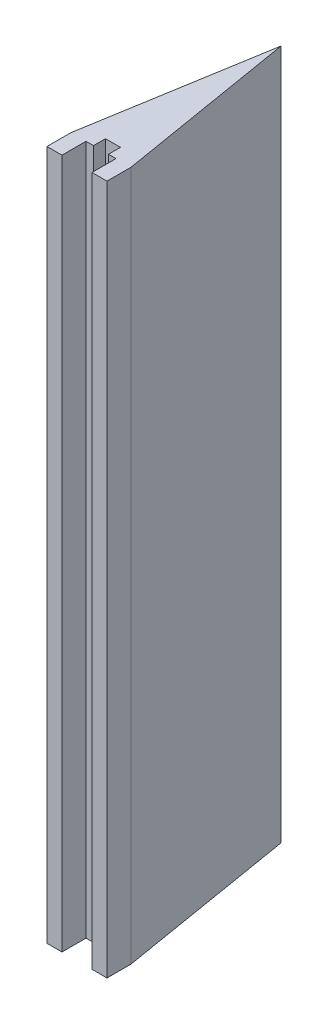
ISO-10303-21;
HEADER;
FILE_DESCRIPTION(('STEP AP214'),'2;1');
FILE_NAME('part.step','',(''),(''),'','','');
FILE_SCHEMA(('AUTOMOTIVE_DESIGN { 1 0 10303 214 1 1 1 1 }'));
ENDSEC;
DATA;
#1=APPLICATION_CONTEXT('core data for automotive mechanical design processes');
#2=APPLICATION_PROTOCOL_DEFINITION('international standard','automotive_design',2000,#1);
#3=PRODUCT_CONTEXT('',#1,'mechanical');
#4=PRODUCT('Part','Part','',(#3));
#5=PRODUCT_RELATED_PRODUCT_CATEGORY('part','',(#4));
#6=PRODUCT_DEFINITION_FORMATION('','',#4);
#7=PRODUCT_DEFINITION_CONTEXT('part definition',#1,'design');
#8=PRODUCT_DEFINITION('design','',#6,#7);
#9=PRODUCT_DEFINITION_SHAPE('','',#8);
#10=(LENGTH_UNIT() NAMED_UNIT(*) SI_UNIT(.MILLI.,.METRE.));
#11=(NAMED_UNIT(*) PLANE_ANGLE_UNIT() SI_UNIT($,.RADIAN.));
#12=(NAMED_UNIT(*) SI_UNIT($,.STERADIAN.) SOLID_ANGLE_UNIT());
#13=UNCERTAINTY_MEASURE_WITH_UNIT(LENGTH_MEASURE(1.E-05),#10,'distance_accuracy_value','');
#14=(GEOMETRIC_REPRESENTATION_CONTEXT(3) GLOBAL_UNCERTAINTY_ASSIGNED_CONTEXT((#13)) GLOBAL_UNIT_ASSIGNED_CONTEXT((#10,
#11,#12)) REPRESENTATION_CONTEXT('',''));
#15=CARTESIAN_POINT('',(0.,0.,0.));
#16=DIRECTION('',(0.,0.,1.));
#17=DIRECTION('',(1.,0.,0.));
#18=AXIS2_PLACEMENT_3D('',#15,#16,#17);
#19=CARTESIAN_POINT('',(0.,146.05,-38.1));
#20=DIRECTION('',(-0.986393923832144,0.,0.164398987305357));
#21=DIRECTION('',(0.164398987305357,0.,0.986393923832144));
#22=AXIS2_PLACEMENT_3D('',#19,#20,#21);
#23=PLANE('',#22);
#24=DIRECTION('',(-0.164398987305357,0.,-0.986393923832144));
#25=VECTOR('',#24,1.);
#26=CARTESIAN_POINT('',(0.,0.,-38.1));
#27=LINE('',#26,#25);
#28=CARTESIAN_POINT('',(6.35,0.,0.));
#29=VERTEX_POINT('',#28);
#30=CARTESIAN_POINT('',(0.,0.,-38.1));
#31=VERTEX_POINT('',#30);
#32=EDGE_CURVE('E176',#29,#31,#27,.T.);
#33=ORIENTED_EDGE('',*,*,#32,.T.);
#34=DIRECTION('',(0.,-1.,0.));
#35=VECTOR('',#34,1.);
#36=CARTESIAN_POINT('',(0.,146.05,-38.1));
#37=LINE('',#36,#35);
#38=CARTESIAN_POINT('',(0.,146.05,-38.1));
#39=VERTEX_POINT('',#38);
#40=EDGE_CURVE('E11',#39,#31,#37,.T.);
#41=ORIENTED_EDGE('',*,*,#40,.F.);
#42=DIRECTION('',(-0.164398987305357,0.,-0.986393923832144));
#43=VECTOR('',#42,1.);
#44=CARTESIAN_POINT('',(0.,146.05,-38.1));
#45=LINE('',#44,#43);
#46=CARTESIAN_POINT('',(6.35,146.05,0.));
#47=VERTEX_POINT('',#46);
#48=EDGE_CURVE('E213',#47,#39,#45,.T.);
#49=ORIENTED_EDGE('',*,*,#48,.F.);
#50=DIRECTION('',(0.,-1.,0.));
#51=VECTOR('',#50,1.);
#52=CARTESIAN_POINT('',(6.35,146.05,0.));
#53=LINE('',#52,#51);
#54=EDGE_CURVE('E172',#47,#29,#53,.T.);
#55=ORIENTED_EDGE('',*,*,#54,.T.);
#56=EDGE_LOOP('',(#33,#41,#49,#55));
#57=FACE_BOUND('',#56,.T.);
#58=ADVANCED_FACE('F45',(#57),#23,.F.);
#59=CARTESIAN_POINT('',(0.,146.05,-38.1));
#60=DIRECTION('',(0.986393923832144,0.,0.164398987305357));
#61=DIRECTION('',(0.164398987305357,0.,-0.986393923832144));
#62=AXIS2_PLACEMENT_3D('',#59,#60,#61);
#63=PLANE('',#62);
#64=DIRECTION('',(-0.164398987305357,0.,0.986393923832144));
#65=VECTOR('',#64,1.);
#66=CARTESIAN_POINT('',(0.,0.,-38.1));
#67=LINE('',#66,#65);
#68=CARTESIAN_POINT('',(-6.35,0.,0.));
#69=VERTEX_POINT('',#68);
#70=EDGE_CURVE('E180',#31,#69,#67,.T.);
#71=ORIENTED_EDGE('',*,*,#70,.T.);
#72=DIRECTION('',(0.,-1.,0.));
#73=VECTOR('',#72,1.);
#74=CARTESIAN_POINT('',(-6.35,146.05,0.));
#75=LINE('',#74,#73);
#76=CARTESIAN_POINT('',(-6.35,146.05,0.));
#77=VERTEX_POINT('',#76);
#78=EDGE_CURVE('E54',#77,#69,#75,.T.);
#79=ORIENTED_EDGE('',*,*,#78,.F.);
#80=DIRECTION('',(-0.164398987305357,0.,0.986393923832144));
#81=VECTOR('',#80,1.);
#82=CARTESIAN_POINT('',(0.,146.05,-38.1));
#83=LINE('',#82,#81);
#84=EDGE_CURVE('E120',#39,#77,#83,.T.);
#85=ORIENTED_EDGE('',*,*,#84,.F.);
#86=ORIENTED_EDGE('',*,*,#40,.T.);
#87=EDGE_LOOP('',(#71,#79,#85,#86));
#88=FACE_BOUND('',#87,.T.);
#89=ADVANCED_FACE('F314',(#88),#63,.F.);
#90=CARTESIAN_POINT('',(-6.35,146.05,5.08));
#91=DIRECTION('',(1.,0.,0.));
#92=DIRECTION('',(0.,0.,-1.));
#93=AXIS2_PLACEMENT_3D('',#90,#91,#92);
#94=PLANE('',#93);
#95=DIRECTION('',(0.,0.,1.));
#96=VECTOR('',#95,1.);
#97=CARTESIAN_POINT('',(-6.35,0.,5.08));
#98=LINE('',#97,#96);
#99=CARTESIAN_POINT('',(-6.35,0.,5.08));
#100=VERTEX_POINT('',#99);
#101=EDGE_CURVE('E183',#69,#100,#98,.T.);
#102=ORIENTED_EDGE('',*,*,#101,.T.);
#103=DIRECTION('',(0.,-1.,0.));
#104=VECTOR('',#103,1.);
#105=CARTESIAN_POINT('',(-6.35,146.05,5.08));
#106=LINE('',#105,#104);
#107=CARTESIAN_POINT('',(-6.35,146.05,5.08));
#108=VERTEX_POINT('',#107);
#109=EDGE_CURVE('E244',#108,#100,#106,.T.);
#110=ORIENTED_EDGE('',*,*,#109,.F.);
#111=DIRECTION('',(0.,0.,1.));
#112=VECTOR('',#111,1.);
#113=CARTESIAN_POINT('',(-6.35,146.05,5.08));
#114=LINE('',#113,#112);
#115=EDGE_CURVE('E254',#77,#108,#114,.T.);
#116=ORIENTED_EDGE('',*,*,#115,.F.);
#117=ORIENTED_EDGE('',*,*,#78,.T.);
#118=EDGE_LOOP('',(#102,#110,#116,#117));
#119=FACE_BOUND('',#118,.T.);
#120=ADVANCED_FACE('F252',(#119),#94,.F.);
#121=CARTESIAN_POINT('',(-3.175,146.05,5.08));
#122=DIRECTION('',(0.,0.,-1.));
#123=DIRECTION('',(-1.,0.,0.));
#124=AXIS2_PLACEMENT_3D('',#121,#122,#123);
#125=PLANE('',#124);
#126=DIRECTION('',(1.,0.,0.));
#127=VECTOR('',#126,1.);
#128=CARTESIAN_POINT('',(-3.175,0.,5.08));
#129=LINE('',#128,#127);
#130=CARTESIAN_POINT('',(-3.175,0.,5.08));
#131=VERTEX_POINT('',#130);
#132=EDGE_CURVE('E186',#100,#131,#129,.T.);
#133=ORIENTED_EDGE('',*,*,#132,.T.);
#134=DIRECTION('',(0.,-1.,0.));
#135=VECTOR('',#134,1.);
#136=CARTESIAN_POINT('',(-3.175,146.05,5.08));
#137=LINE('',#136,#135);
#138=CARTESIAN_POINT('',(-3.175,146.05,5.08));
#139=VERTEX_POINT('',#138);
#140=EDGE_CURVE('E240',#139,#131,#137,.T.);
#141=ORIENTED_EDGE('',*,*,#140,.F.);
#142=DIRECTION('',(1.,0.,0.));
#143=VECTOR('',#142,1.);
#144=CARTESIAN_POINT('',(-3.175,146.05,5.08));
#145=LINE('',#144,#143);
#146=EDGE_CURVE('E273',#108,#139,#145,.T.);
#147=ORIENTED_EDGE('',*,*,#146,.F.);
#148=ORIENTED_EDGE('',*,*,#109,.T.);
#149=EDGE_LOOP('',(#133,#141,#147,#148));
#150=FACE_BOUND('',#149,.T.);
#151=ADVANCED_FACE('F263',(#150),#125,.F.);
#152=CARTESIAN_POINT('',(-3.175,146.05,0.));
#153=DIRECTION('',(-1.,0.,0.));
#154=DIRECTION('',(0.,0.,1.));
#155=AXIS2_PLACEMENT_3D('',#152,#153,#154);
#156=PLANE('',#155);
#157=DIRECTION('',(0.,0.,-1.));
#158=VECTOR('',#157,1.);
#159=CARTESIAN_POINT('',(-3.175,0.,0.));
#160=LINE('',#159,#158);
#161=CARTESIAN_POINT('',(-3.175,0.,0.));
#162=VERTEX_POINT('',#161);
#163=EDGE_CURVE('E189',#131,#162,#160,.T.);
#164=ORIENTED_EDGE('',*,*,#163,.T.);
#165=DIRECTION('',(0.,-1.,0.));
#166=VECTOR('',#165,1.);
#167=CARTESIAN_POINT('',(-3.175,146.05,0.));
#168=LINE('',#167,#166);
#169=CARTESIAN_POINT('',(-3.175,146.05,0.));
#170=VERTEX_POINT('',#169);
#171=EDGE_CURVE('E236',#170,#162,#168,.T.);
#172=ORIENTED_EDGE('',*,*,#171,.F.);
#173=DIRECTION('',(0.,0.,-1.));
#174=VECTOR('',#173,1.);
#175=CARTESIAN_POINT('',(-3.175,146.05,0.));
#176=LINE('',#175,#174);
#177=EDGE_CURVE('E269',#139,#170,#176,.T.);
#178=ORIENTED_EDGE('',*,*,#177,.F.);
#179=ORIENTED_EDGE('',*,*,#140,.T.);
#180=EDGE_LOOP('',(#164,#172,#178,#179));
#181=FACE_BOUND('',#180,.T.);
#182=ADVANCED_FACE('F267',(#181),#156,.F.);
#183=CARTESIAN_POINT('',(-3.175,146.05,0.));
#184=DIRECTION('',(0.,0.,-1.));
#185=DIRECTION('',(-1.,0.,0.));
#186=AXIS2_PLACEMENT_3D('',#183,#184,#185);
#187=PLANE('',#186);
#188=DIRECTION('',(1.,0.,0.));
#189=VECTOR('',#188,1.);
#190=CARTESIAN_POINT('',(-3.175,0.,0.));
#191=LINE('',#190,#189);
#192=CARTESIAN_POINT('',(-1.5875,0.,0.));
#193=VERTEX_POINT('',#192);
#194=EDGE_CURVE('E192',#162,#193,#191,.T.);
#195=ORIENTED_EDGE('',*,*,#194,.T.);
#196=DIRECTION('',(0.,-1.,0.));
#197=VECTOR('',#196,1.);
#198=CARTESIAN_POINT('',(-1.5875,146.05,0.));
#199=LINE('',#198,#197);
#200=CARTESIAN_POINT('',(-1.5875,146.05,0.));
#201=VERTEX_POINT('',#200);
#202=EDGE_CURVE('E232',#201,#193,#199,.T.);
#203=ORIENTED_EDGE('',*,*,#202,.F.);
#204=DIRECTION('',(1.,0.,0.));
#205=VECTOR('',#204,1.);
#206=CARTESIAN_POINT('',(-3.175,146.05,0.));
#207=LINE('',#206,#205);
#208=EDGE_CURVE('E272',#170,#201,#207,.T.);
#209=ORIENTED_EDGE('',*,*,#208,.F.);
#210=ORIENTED_EDGE('',*,*,#171,.T.);
#211=EDGE_LOOP('',(#195,#203,#209,#210));
#212=FACE_BOUND('',#211,.T.);
#213=ADVANCED_FACE('F327',(#212),#187,.F.);
#214=CARTESIAN_POINT('',(-1.5875,146.05,0.));
#215=DIRECTION('',(-1.,0.,0.));
#216=DIRECTION('',(0.,0.,1.));
#217=AXIS2_PLACEMENT_3D('',#214,#215,#216);
#218=PLANE('',#217);
#219=DIRECTION('',(0.,0.,-1.));
#220=VECTOR('',#219,1.);
#221=CARTESIAN_POINT('',(-1.5875,0.,0.));
#222=LINE('',#221,#220);
#223=CARTESIAN_POINT('',(-1.5875,0.,-2.54));
#224=VERTEX_POINT('',#223);
#225=EDGE_CURVE('E195',#193,#224,#222,.T.);
#226=ORIENTED_EDGE('',*,*,#225,.T.);
#227=DIRECTION('',(0.,-1.,0.));
#228=VECTOR('',#227,1.);
#229=CARTESIAN_POINT('',(-1.5875,146.05,-2.54));
#230=LINE('',#229,#228);
#231=CARTESIAN_POINT('',(-1.5875,146.05,-2.54));
#232=VERTEX_POINT('',#231);
#233=EDGE_CURVE('E228',#232,#224,#230,.T.);
#234=ORIENTED_EDGE('',*,*,#233,.F.);
#235=DIRECTION('',(0.,0.,-1.));
#236=VECTOR('',#235,1.);
#237=CARTESIAN_POINT('',(-1.5875,146.05,0.));
#238=LINE('',#237,#236);
#239=EDGE_CURVE('E277',#201,#232,#238,.T.);
#240=ORIENTED_EDGE('',*,*,#239,.F.);
#241=ORIENTED_EDGE('',*,*,#202,.T.);
#242=EDGE_LOOP('',(#226,#234,#240,#241));
#243=FACE_BOUND('',#242,.T.);
#244=ADVANCED_FACE('F330',(#243),#218,.F.);
#245=CARTESIAN_POINT('',(-1.5875,146.05,-2.54));
#246=DIRECTION('',(0.,0.,-1.));
#247=DIRECTION('',(-1.,0.,0.));
#248=AXIS2_PLACEMENT_3D('',#245,#246,#247);
#249=PLANE('',#248);
#250=DIRECTION('',(1.,0.,0.));
#251=VECTOR('',#250,1.);
#252=CARTESIAN_POINT('',(-1.5875,0.,-2.54));
#253=LINE('',#252,#251);
#254=CARTESIAN_POINT('',(1.5875,0.,-2.54));
#255=VERTEX_POINT('',#254);
#256=EDGE_CURVE('E198',#224,#255,#253,.T.);
#257=ORIENTED_EDGE('',*,*,#256,.T.);
#258=DIRECTION('',(0.,-1.,0.));
#259=VECTOR('',#258,1.);
#260=CARTESIAN_POINT('',(1.5875,146.05,-2.54));
#261=LINE('',#260,#259);
#262=CARTESIAN_POINT('',(1.5875,146.05,-2.54));
#263=VERTEX_POINT('',#262);
#264=EDGE_CURVE('E224',#263,#255,#261,.T.);
#265=ORIENTED_EDGE('',*,*,#264,.F.);
#266=DIRECTION('',(1.,0.,0.));
#267=VECTOR('',#266,1.);
#268=CARTESIAN_POINT('',(-1.5875,146.05,-2.54));
#269=LINE('',#268,#267);
#270=EDGE_CURVE('E284',#232,#263,#269,.T.);
#271=ORIENTED_EDGE('',*,*,#270,.F.);
#272=ORIENTED_EDGE('',*,*,#233,.T.);
#273=EDGE_LOOP('',(#257,#265,#271,#272));
#274=FACE_BOUND('',#273,.T.);
#275=ADVANCED_FACE('F334',(#274),#249,.F.);
#276=CARTESIAN_POINT('',(1.5875,146.05,-2.54));
#277=DIRECTION('',(1.,0.,0.));
#278=DIRECTION('',(0.,0.,-1.));
#279=AXIS2_PLACEMENT_3D('',#276,#277,#278);
#280=PLANE('',#279);
#281=DIRECTION('',(0.,0.,1.));
#282=VECTOR('',#281,1.);
#283=CARTESIAN_POINT('',(1.5875,0.,-2.54));
#284=LINE('',#283,#282);
#285=CARTESIAN_POINT('',(1.5875,0.,0.));
#286=VERTEX_POINT('',#285);
#287=EDGE_CURVE('E201',#255,#286,#284,.T.);
#288=ORIENTED_EDGE('',*,*,#287,.T.);
#289=DIRECTION('',(0.,-1.,0.));
#290=VECTOR('',#289,1.);
#291=CARTESIAN_POINT('',(1.5875,146.05,0.));
#292=LINE('',#291,#290);
#293=CARTESIAN_POINT('',(1.5875,146.05,0.));
#294=VERTEX_POINT('',#293);
#295=EDGE_CURVE('E220',#294,#286,#292,.T.);
#296=ORIENTED_EDGE('',*,*,#295,.F.);
#297=DIRECTION('',(0.,0.,1.));
#298=VECTOR('',#297,1.);
#299=CARTESIAN_POINT('',(1.5875,146.05,-2.54));
#300=LINE('',#299,#298);
#301=EDGE_CURVE('E287',#263,#294,#300,.T.);
#302=ORIENTED_EDGE('',*,*,#301,.F.);
#303=ORIENTED_EDGE('',*,*,#264,.T.);
#304=EDGE_LOOP('',(#288,#296,#302,#303));
#305=FACE_BOUND('',#304,.T.);
#306=ADVANCED_FACE('F295',(#305),#280,.F.);
#307=CARTESIAN_POINT('',(1.5875,146.05,0.));
#308=DIRECTION('',(0.,0.,-1.));
#309=DIRECTION('',(-1.,0.,0.));
#310=AXIS2_PLACEMENT_3D('',#307,#308,#309);
#311=PLANE('',#310);
#312=DIRECTION('',(1.,0.,0.));
#313=VECTOR('',#312,1.);
#314=CARTESIAN_POINT('',(1.5875,0.,0.));
#315=LINE('',#314,#313);
#316=CARTESIAN_POINT('',(3.175,0.,0.));
#317=VERTEX_POINT('',#316);
#318=EDGE_CURVE('E204',#286,#317,#315,.T.);
#319=ORIENTED_EDGE('',*,*,#318,.T.);
#320=DIRECTION('',(0.,-1.,0.));
#321=VECTOR('',#320,1.);
#322=CARTESIAN_POINT('',(3.175,146.05,0.));
#323=LINE('',#322,#321);
#324=CARTESIAN_POINT('',(3.175,146.05,0.));
#325=VERTEX_POINT('',#324);
#326=EDGE_CURVE('E165',#325,#317,#323,.T.);
#327=ORIENTED_EDGE('',*,*,#326,.F.);
#328=DIRECTION('',(1.,0.,0.));
#329=VECTOR('',#328,1.);
#330=CARTESIAN_POINT('',(1.5875,146.05,0.));
#331=LINE('',#330,#329);
#332=EDGE_CURVE('E154',#294,#325,#331,.T.);
#333=ORIENTED_EDGE('',*,*,#332,.F.);
#334=ORIENTED_EDGE('',*,*,#295,.T.);
#335=EDGE_LOOP('',(#319,#327,#333,#334));
#336=FACE_BOUND('',#335,.T.);
#337=ADVANCED_FACE('F299',(#336),#311,.F.);
#338=CARTESIAN_POINT('',(3.175,146.05,0.));
#339=DIRECTION('',(1.,0.,0.));
#340=DIRECTION('',(0.,0.,-1.));
#341=AXIS2_PLACEMENT_3D('',#338,#339,#340);
#342=PLANE('',#341);
#343=DIRECTION('',(0.,0.,1.));
#344=VECTOR('',#343,1.);
#345=CARTESIAN_POINT('',(3.175,0.,0.));
#346=LINE('',#345,#344);
#347=CARTESIAN_POINT('',(3.175,0.,5.08));
#348=VERTEX_POINT('',#347);
#349=EDGE_CURVE('E163',#317,#348,#346,.T.);
#350=ORIENTED_EDGE('',*,*,#349,.T.);
#351=DIRECTION('',(0.,-1.,0.));
#352=VECTOR('',#351,1.);
#353=CARTESIAN_POINT('',(3.175,146.05,5.08));
#354=LINE('',#353,#352);
#355=CARTESIAN_POINT('',(3.175,146.05,5.08));
#356=VERTEX_POINT('',#355);
#357=EDGE_CURVE('E160',#356,#348,#354,.T.);
#358=ORIENTED_EDGE('',*,*,#357,.F.);
#359=DIRECTION('',(0.,0.,1.));
#360=VECTOR('',#359,1.);
#361=CARTESIAN_POINT('',(3.175,146.05,0.));
#362=LINE('',#361,#360);
#363=EDGE_CURVE('E148',#325,#356,#362,.T.);
#364=ORIENTED_EDGE('',*,*,#363,.F.);
#365=ORIENTED_EDGE('',*,*,#326,.T.);
#366=EDGE_LOOP('',(#350,#358,#364,#365));
#367=FACE_BOUND('',#366,.T.);
#368=ADVANCED_FACE('F161',(#367),#342,.F.);
#369=CARTESIAN_POINT('',(3.175,146.05,5.08));
#370=DIRECTION('',(0.,0.,-1.));
#371=DIRECTION('',(-1.,0.,0.));
#372=AXIS2_PLACEMENT_3D('',#369,#370,#371);
#373=PLANE('',#372);
#374=DIRECTION('',(1.,0.,0.));
#375=VECTOR('',#374,1.);
#376=CARTESIAN_POINT('',(3.175,0.,5.08));
#377=LINE('',#376,#375);
#378=CARTESIAN_POINT('',(6.35,0.,5.08));
#379=VERTEX_POINT('',#378);
#380=EDGE_CURVE('E106',#348,#379,#377,.T.);
#381=ORIENTED_EDGE('',*,*,#380,.T.);
#382=DIRECTION('',(0.,-1.,0.));
#383=VECTOR('',#382,1.);
#384=CARTESIAN_POINT('',(6.35,146.05,5.08));
#385=LINE('',#384,#383);
#386=CARTESIAN_POINT('',(6.35,146.05,5.08));
#387=VERTEX_POINT('',#386);
#388=EDGE_CURVE('E166',#387,#379,#385,.T.);
#389=ORIENTED_EDGE('',*,*,#388,.F.);
#390=DIRECTION('',(1.,0.,0.));
#391=VECTOR('',#390,1.);
#392=CARTESIAN_POINT('',(3.175,146.05,5.08));
#393=LINE('',#392,#391);
#394=EDGE_CURVE('E152',#356,#387,#393,.T.);
#395=ORIENTED_EDGE('',*,*,#394,.F.);
#396=ORIENTED_EDGE('',*,*,#357,.T.);
#397=EDGE_LOOP('',(#381,#389,#395,#396));
#398=FACE_BOUND('',#397,.T.);
#399=ADVANCED_FACE('F168',(#398),#373,.F.);
#400=CARTESIAN_POINT('',(6.35,146.05,5.08));
#401=DIRECTION('',(-1.,0.,0.));
#402=DIRECTION('',(0.,0.,1.));
#403=AXIS2_PLACEMENT_3D('',#400,#401,#402);
#404=PLANE('',#403);
#405=DIRECTION('',(0.,0.,-1.));
#406=VECTOR('',#405,1.);
#407=CARTESIAN_POINT('',(6.35,0.,5.08));
#408=LINE('',#407,#406);
#409=EDGE_CURVE('E112',#379,#29,#408,.T.);
#410=ORIENTED_EDGE('',*,*,#409,.T.);
#411=ORIENTED_EDGE('',*,*,#54,.F.);
#412=DIRECTION('',(0.,0.,-1.));
#413=VECTOR('',#412,1.);
#414=CARTESIAN_POINT('',(6.35,146.05,5.08));
#415=LINE('',#414,#413);
#416=EDGE_CURVE('E62',#387,#47,#415,.T.);
#417=ORIENTED_EDGE('',*,*,#416,.F.);
#418=ORIENTED_EDGE('',*,*,#388,.T.);
#419=EDGE_LOOP('',(#410,#411,#417,#418));
#420=FACE_BOUND('',#419,.T.);
#421=ADVANCED_FACE('F303',(#420),#404,.F.);
#422=CARTESIAN_POINT('',(0.,146.05,0.));
#423=DIRECTION('',(0.,1.,0.));
#424=DIRECTION('',(0.,0.,1.));
#425=AXIS2_PLACEMENT_3D('',#422,#423,#424);
#426=PLANE('',#425);
#427=ORIENTED_EDGE('',*,*,#48,.T.);
#428=ORIENTED_EDGE('',*,*,#84,.T.);
#429=ORIENTED_EDGE('',*,*,#115,.T.);
#430=ORIENTED_EDGE('',*,*,#146,.T.);
#431=ORIENTED_EDGE('',*,*,#177,.T.);
#432=ORIENTED_EDGE('',*,*,#208,.T.);
#433=ORIENTED_EDGE('',*,*,#239,.T.);
#434=ORIENTED_EDGE('',*,*,#270,.T.);
#435=ORIENTED_EDGE('',*,*,#301,.T.);
#436=ORIENTED_EDGE('',*,*,#332,.T.);
#437=ORIENTED_EDGE('',*,*,#363,.T.);
#438=ORIENTED_EDGE('',*,*,#394,.T.);
#439=ORIENTED_EDGE('',*,*,#416,.T.);
#440=EDGE_LOOP('',(#427,#428,#429,#430,#431,#432,#433,#434,#435,#436,#437,#438,#439));
#441=FACE_BOUND('',#440,.T.);
#442=ADVANCED_FACE('F150',(#441),#426,.T.);
#443=CARTESIAN_POINT('',(0.,0.,0.));
#444=DIRECTION('',(0.,1.,0.));
#445=DIRECTION('',(0.,0.,1.));
#446=AXIS2_PLACEMENT_3D('',#443,#444,#445);
#447=PLANE('',#446);
#448=ORIENTED_EDGE('',*,*,#32,.F.);
#449=ORIENTED_EDGE('',*,*,#409,.F.);
#450=ORIENTED_EDGE('',*,*,#380,.F.);
#451=ORIENTED_EDGE('',*,*,#349,.F.);
#452=ORIENTED_EDGE('',*,*,#318,.F.);
#453=ORIENTED_EDGE('',*,*,#287,.F.);
#454=ORIENTED_EDGE('',*,*,#256,.F.);
#455=ORIENTED_EDGE('',*,*,#225,.F.);
#456=ORIENTED_EDGE('',*,*,#194,.F.);
#457=ORIENTED_EDGE('',*,*,#163,.F.);
#458=ORIENTED_EDGE('',*,*,#132,.F.);
#459=ORIENTED_EDGE('',*,*,#101,.F.);
#460=ORIENTED_EDGE('',*,*,#70,.F.);
#461=EDGE_LOOP('',(#448,#449,#450,#451,#452,#453,#454,#455,#456,#457,#458,#459,#460));
#462=FACE_BOUND('',#461,.T.);
#463=ADVANCED_FACE('F258',(#462),#447,.F.);
#464=CLOSED_SHELL('',(#58,#89,#120,#151,#182,#213,#244,#275,#306,#337,#368,#399,#421,#442,#463));
#465=MANIFOLD_SOLID_BREP('B2',#464);
#466=ADVANCED_BREP_SHAPE_REPRESENTATION('',(#18,#465),#14);
#467=SHAPE_DEFINITION_REPRESENTATION(#9,#466);
ENDSEC;
END-ISO-10303-21;
